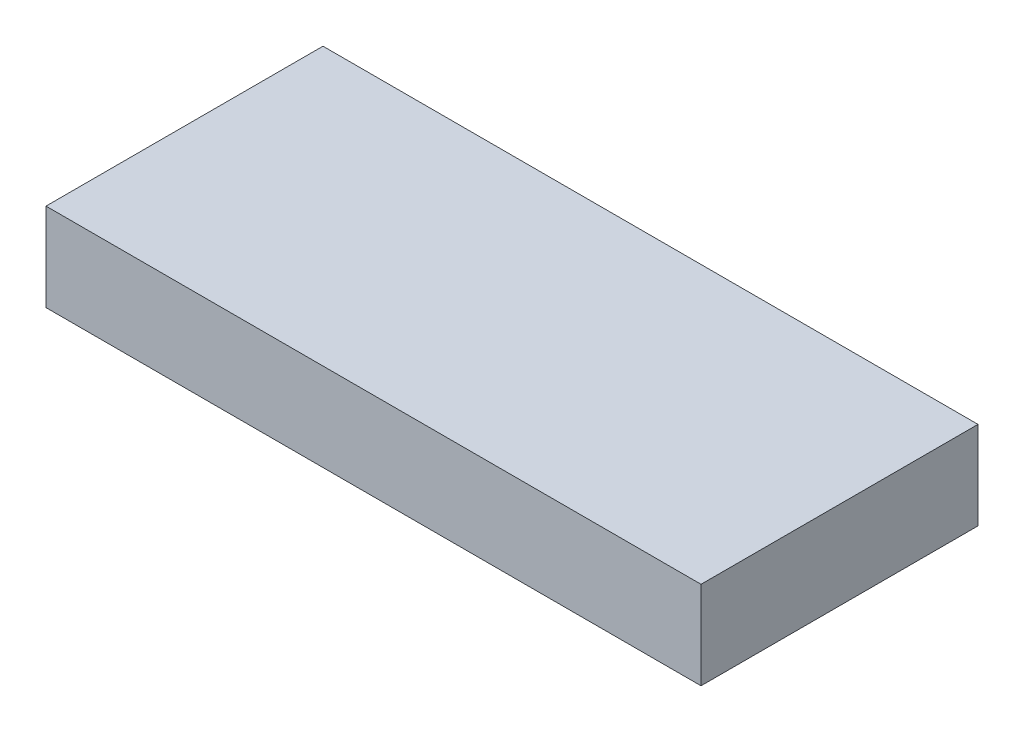
ISO-10303-21;
HEADER;
FILE_DESCRIPTION(('STEP AP214'),'2;1');
FILE_NAME('part.step','',(''),(''),'','','');
FILE_SCHEMA(('AUTOMOTIVE_DESIGN { 1 0 10303 214 1 1 1 1 }'));
ENDSEC;
DATA;
#1=APPLICATION_CONTEXT('core data for automotive mechanical design processes');
#2=APPLICATION_PROTOCOL_DEFINITION('international standard','automotive_design',2000,#1);
#3=PRODUCT_CONTEXT('',#1,'mechanical');
#4=PRODUCT('Part','Part','',(#3));
#5=PRODUCT_RELATED_PRODUCT_CATEGORY('part','',(#4));
#6=PRODUCT_DEFINITION_FORMATION('','',#4);
#7=PRODUCT_DEFINITION_CONTEXT('part definition',#1,'design');
#8=PRODUCT_DEFINITION('design','',#6,#7);
#9=PRODUCT_DEFINITION_SHAPE('','',#8);
#10=(LENGTH_UNIT() NAMED_UNIT(*) SI_UNIT(.MILLI.,.METRE.));
#11=(NAMED_UNIT(*) PLANE_ANGLE_UNIT() SI_UNIT($,.RADIAN.));
#12=(NAMED_UNIT(*) SI_UNIT($,.STERADIAN.) SOLID_ANGLE_UNIT());
#13=UNCERTAINTY_MEASURE_WITH_UNIT(LENGTH_MEASURE(1.E-05),#10,'distance_accuracy_value','');
#14=(GEOMETRIC_REPRESENTATION_CONTEXT(3) GLOBAL_UNCERTAINTY_ASSIGNED_CONTEXT((#13)) GLOBAL_UNIT_ASSIGNED_CONTEXT((#10,
#11,#12)) REPRESENTATION_CONTEXT('',''));
#15=CARTESIAN_POINT('',(0.,0.,0.));
#16=DIRECTION('',(0.,0.,1.));
#17=DIRECTION('',(1.,0.,0.));
#18=AXIS2_PLACEMENT_3D('',#15,#16,#17);
#19=CARTESIAN_POINT('',(0.,6.35,0.));
#20=DIRECTION('',(1.,0.,0.));
#21=DIRECTION('',(0.,0.,-1.));
#22=AXIS2_PLACEMENT_3D('',#19,#20,#21);
#23=PLANE('',#22);
#24=DIRECTION('',(0.,0.,1.));
#25=VECTOR('',#24,1.);
#26=CARTESIAN_POINT('',(0.,0.,0.));
#27=LINE('',#26,#25);
#28=CARTESIAN_POINT('',(0.,0.,-20.));
#29=VERTEX_POINT('',#28);
#30=CARTESIAN_POINT('',(0.,0.,0.));
#31=VERTEX_POINT('',#30);
#32=EDGE_CURVE('E107',#29,#31,#27,.T.);
#33=ORIENTED_EDGE('',*,*,#32,.T.);
#34=DIRECTION('',(0.,-1.,0.));
#35=VECTOR('',#34,1.);
#36=CARTESIAN_POINT('',(0.,6.35,0.));
#37=LINE('',#36,#35);
#38=CARTESIAN_POINT('',(0.,6.35,0.));
#39=VERTEX_POINT('',#38);
#40=EDGE_CURVE('E11',#39,#31,#37,.T.);
#41=ORIENTED_EDGE('',*,*,#40,.F.);
#42=DIRECTION('',(0.,0.,1.));
#43=VECTOR('',#42,1.);
#44=CARTESIAN_POINT('',(0.,6.35,0.));
#45=LINE('',#44,#43);
#46=CARTESIAN_POINT('',(0.,6.35,-20.));
#47=VERTEX_POINT('',#46);
#48=EDGE_CURVE('E91',#47,#39,#45,.T.);
#49=ORIENTED_EDGE('',*,*,#48,.F.);
#50=DIRECTION('',(0.,-1.,0.));
#51=VECTOR('',#50,1.);
#52=CARTESIAN_POINT('',(0.,6.35,-20.));
#53=LINE('',#52,#51);
#54=EDGE_CURVE('E103',#47,#29,#53,.T.);
#55=ORIENTED_EDGE('',*,*,#54,.T.);
#56=EDGE_LOOP('',(#33,#41,#49,#55));
#57=FACE_BOUND('',#56,.T.);
#58=ADVANCED_FACE('F39',(#57),#23,.F.);
#59=CARTESIAN_POINT('',(0.,6.35,0.));
#60=DIRECTION('',(0.,0.,-1.));
#61=DIRECTION('',(-1.,0.,0.));
#62=AXIS2_PLACEMENT_3D('',#59,#60,#61);
#63=PLANE('',#62);
#64=DIRECTION('',(1.,0.,0.));
#65=VECTOR('',#64,1.);
#66=CARTESIAN_POINT('',(0.,0.,0.));
#67=LINE('',#66,#65);
#68=CARTESIAN_POINT('',(47.3,0.,0.));
#69=VERTEX_POINT('',#68);
#70=EDGE_CURVE('E96',#31,#69,#67,.T.);
#71=ORIENTED_EDGE('',*,*,#70,.T.);
#72=DIRECTION('',(0.,-1.,0.));
#73=VECTOR('',#72,1.);
#74=CARTESIAN_POINT('',(47.3,6.35,0.));
#75=LINE('',#74,#73);
#76=CARTESIAN_POINT('',(47.3,6.35,0.));
#77=VERTEX_POINT('',#76);
#78=EDGE_CURVE('E48',#77,#69,#75,.T.);
#79=ORIENTED_EDGE('',*,*,#78,.F.);
#80=DIRECTION('',(1.,0.,0.));
#81=VECTOR('',#80,1.);
#82=CARTESIAN_POINT('',(0.,6.35,0.));
#83=LINE('',#82,#81);
#84=EDGE_CURVE('E86',#39,#77,#83,.T.);
#85=ORIENTED_EDGE('',*,*,#84,.F.);
#86=ORIENTED_EDGE('',*,*,#40,.T.);
#87=EDGE_LOOP('',(#71,#79,#85,#86));
#88=FACE_BOUND('',#87,.T.);
#89=ADVANCED_FACE('F95',(#88),#63,.F.);
#90=CARTESIAN_POINT('',(47.3,6.35,0.));
#91=DIRECTION('',(-1.,0.,0.));
#92=DIRECTION('',(0.,0.,1.));
#93=AXIS2_PLACEMENT_3D('',#90,#91,#92);
#94=PLANE('',#93);
#95=DIRECTION('',(0.,0.,-1.));
#96=VECTOR('',#95,1.);
#97=CARTESIAN_POINT('',(47.3,0.,0.));
#98=LINE('',#97,#96);
#99=CARTESIAN_POINT('',(47.3,0.,-20.));
#100=VERTEX_POINT('',#99);
#101=EDGE_CURVE('E73',#69,#100,#98,.T.);
#102=ORIENTED_EDGE('',*,*,#101,.T.);
#103=DIRECTION('',(0.,-1.,0.));
#104=VECTOR('',#103,1.);
#105=CARTESIAN_POINT('',(47.3,6.35,-20.));
#106=LINE('',#105,#104);
#107=CARTESIAN_POINT('',(47.3,6.35,-20.));
#108=VERTEX_POINT('',#107);
#109=EDGE_CURVE('E98',#108,#100,#106,.T.);
#110=ORIENTED_EDGE('',*,*,#109,.F.);
#111=DIRECTION('',(0.,0.,-1.));
#112=VECTOR('',#111,1.);
#113=CARTESIAN_POINT('',(47.3,6.35,0.));
#114=LINE('',#113,#112);
#115=EDGE_CURVE('E89',#77,#108,#114,.T.);
#116=ORIENTED_EDGE('',*,*,#115,.F.);
#117=ORIENTED_EDGE('',*,*,#78,.T.);
#118=EDGE_LOOP('',(#102,#110,#116,#117));
#119=FACE_BOUND('',#118,.T.);
#120=ADVANCED_FACE('F99',(#119),#94,.F.);
#121=CARTESIAN_POINT('',(0.,6.35,-20.));
#122=DIRECTION('',(0.,0.,1.));
#123=DIRECTION('',(1.,0.,0.));
#124=AXIS2_PLACEMENT_3D('',#121,#122,#123);
#125=PLANE('',#124);
#126=DIRECTION('',(-1.,0.,0.));
#127=VECTOR('',#126,1.);
#128=CARTESIAN_POINT('',(0.,0.,-20.));
#129=LINE('',#128,#127);
#130=EDGE_CURVE('E79',#100,#29,#129,.T.);
#131=ORIENTED_EDGE('',*,*,#130,.T.);
#132=ORIENTED_EDGE('',*,*,#54,.F.);
#133=DIRECTION('',(-1.,0.,0.));
#134=VECTOR('',#133,1.);
#135=CARTESIAN_POINT('',(0.,6.35,-20.));
#136=LINE('',#135,#134);
#137=EDGE_CURVE('E56',#108,#47,#136,.T.);
#138=ORIENTED_EDGE('',*,*,#137,.F.);
#139=ORIENTED_EDGE('',*,*,#109,.T.);
#140=EDGE_LOOP('',(#131,#132,#138,#139));
#141=FACE_BOUND('',#140,.T.);
#142=ADVANCED_FACE('F120',(#141),#125,.F.);
#143=CARTESIAN_POINT('',(0.,6.35,0.));
#144=DIRECTION('',(0.,-1.,0.));
#145=DIRECTION('',(0.,0.,-1.));
#146=AXIS2_PLACEMENT_3D('',#143,#144,#145);
#147=PLANE('',#146);
#148=ORIENTED_EDGE('',*,*,#48,.T.);
#149=ORIENTED_EDGE('',*,*,#84,.T.);
#150=ORIENTED_EDGE('',*,*,#115,.T.);
#151=ORIENTED_EDGE('',*,*,#137,.T.);
#152=EDGE_LOOP('',(#148,#149,#150,#151));
#153=FACE_BOUND('',#152,.T.);
#154=ADVANCED_FACE('F87',(#153),#147,.F.);
#155=CARTESIAN_POINT('',(0.,0.,0.));
#156=DIRECTION('',(0.,-1.,0.));
#157=DIRECTION('',(0.,0.,-1.));
#158=AXIS2_PLACEMENT_3D('',#155,#156,#157);
#159=PLANE('',#158);
#160=ORIENTED_EDGE('',*,*,#32,.F.);
#161=ORIENTED_EDGE('',*,*,#130,.F.);
#162=ORIENTED_EDGE('',*,*,#101,.F.);
#163=ORIENTED_EDGE('',*,*,#70,.F.);
#164=EDGE_LOOP('',(#160,#161,#162,#163));
#165=FACE_BOUND('',#164,.T.);
#166=ADVANCED_FACE('F123',(#165),#159,.T.);
#167=CLOSED_SHELL('',(#58,#89,#120,#142,#154,#166));
#168=MANIFOLD_SOLID_BREP('B2',#167);
#169=ADVANCED_BREP_SHAPE_REPRESENTATION('',(#18,#168),#14);
#170=SHAPE_DEFINITION_REPRESENTATION(#9,#169);
ENDSEC;
END-ISO-10303-21;
